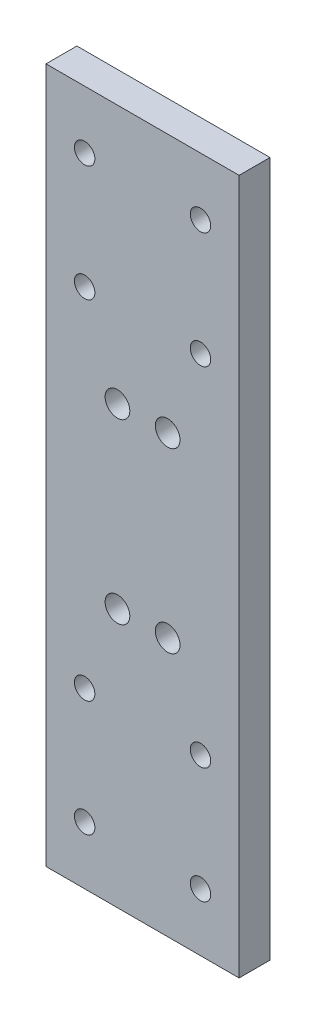
ISO-10303-21;
HEADER;
FILE_DESCRIPTION(('STEP AP214'),'2;1');
FILE_NAME('part.step','',(''),(''),'','','');
FILE_SCHEMA(('AUTOMOTIVE_DESIGN { 1 0 10303 214 1 1 1 1 }'));
ENDSEC;
DATA;
#1=APPLICATION_CONTEXT('core data for automotive mechanical design processes');
#2=APPLICATION_PROTOCOL_DEFINITION('international standard','automotive_design',2000,#1);
#3=PRODUCT_CONTEXT('',#1,'mechanical');
#4=PRODUCT('Part','Part','',(#3));
#5=PRODUCT_RELATED_PRODUCT_CATEGORY('part','',(#4));
#6=PRODUCT_DEFINITION_FORMATION('','',#4);
#7=PRODUCT_DEFINITION_CONTEXT('part definition',#1,'design');
#8=PRODUCT_DEFINITION('design','',#6,#7);
#9=PRODUCT_DEFINITION_SHAPE('','',#8);
#10=(LENGTH_UNIT() NAMED_UNIT(*) SI_UNIT(.MILLI.,.METRE.));
#11=(NAMED_UNIT(*) PLANE_ANGLE_UNIT() SI_UNIT($,.RADIAN.));
#12=(NAMED_UNIT(*) SI_UNIT($,.STERADIAN.) SOLID_ANGLE_UNIT());
#13=UNCERTAINTY_MEASURE_WITH_UNIT(LENGTH_MEASURE(1.E-05),#10,'distance_accuracy_value','');
#14=(GEOMETRIC_REPRESENTATION_CONTEXT(3) GLOBAL_UNCERTAINTY_ASSIGNED_CONTEXT((#13)) GLOBAL_UNIT_ASSIGNED_CONTEXT((#10,
#11,#12)) REPRESENTATION_CONTEXT('',''));
#15=CARTESIAN_POINT('',(0.,0.,0.));
#16=DIRECTION('',(0.,0.,1.));
#17=DIRECTION('',(1.,0.,0.));
#18=AXIS2_PLACEMENT_3D('',#15,#16,#17);
#19=CARTESIAN_POINT('',(-25.,90.,8.));
#20=DIRECTION('',(1.,0.,0.));
#21=DIRECTION('',(0.,1.,0.));
#22=AXIS2_PLACEMENT_3D('',#19,#20,#21);
#23=PLANE('',#22);
#24=DIRECTION('',(0.,-1.,0.));
#25=VECTOR('',#24,1.);
#26=CARTESIAN_POINT('',(-25.,90.,0.));
#27=LINE('',#26,#25);
#28=CARTESIAN_POINT('',(-25.,90.,0.));
#29=VERTEX_POINT('',#28);
#30=CARTESIAN_POINT('',(-25.,-90.,0.));
#31=VERTEX_POINT('',#30);
#32=EDGE_CURVE('E96',#29,#31,#27,.T.);
#33=ORIENTED_EDGE('',*,*,#32,.T.);
#34=DIRECTION('',(0.,0.,-1.));
#35=VECTOR('',#34,1.);
#36=CARTESIAN_POINT('',(-25.,-90.,8.));
#37=LINE('',#36,#35);
#38=CARTESIAN_POINT('',(-25.,-90.,8.));
#39=VERTEX_POINT('',#38);
#40=EDGE_CURVE('E11',#39,#31,#37,.T.);
#41=ORIENTED_EDGE('',*,*,#40,.F.);
#42=DIRECTION('',(0.,-1.,0.));
#43=VECTOR('',#42,1.);
#44=CARTESIAN_POINT('',(-25.,90.,8.));
#45=LINE('',#44,#43);
#46=CARTESIAN_POINT('',(-25.,90.,8.));
#47=VERTEX_POINT('',#46);
#48=EDGE_CURVE('E84',#47,#39,#45,.T.);
#49=ORIENTED_EDGE('',*,*,#48,.F.);
#50=DIRECTION('',(0.,0.,-1.));
#51=VECTOR('',#50,1.);
#52=CARTESIAN_POINT('',(-25.,90.,8.));
#53=LINE('',#52,#51);
#54=EDGE_CURVE('E92',#47,#29,#53,.T.);
#55=ORIENTED_EDGE('',*,*,#54,.T.);
#56=EDGE_LOOP('',(#33,#41,#49,#55));
#57=FACE_BOUND('',#56,.T.);
#58=ADVANCED_FACE('F33',(#57),#23,.F.);
#59=CARTESIAN_POINT('',(-25.,-90.,8.));
#60=DIRECTION('',(0.,1.,0.));
#61=DIRECTION('',(0.,0.,1.));
#62=AXIS2_PLACEMENT_3D('',#59,#60,#61);
#63=PLANE('',#62);
#64=DIRECTION('',(1.,0.,0.));
#65=VECTOR('',#64,1.);
#66=CARTESIAN_POINT('',(-25.,-90.,0.));
#67=LINE('',#66,#65);
#68=CARTESIAN_POINT('',(25.,-90.,0.));
#69=VERTEX_POINT('',#68);
#70=EDGE_CURVE('E88',#31,#69,#67,.T.);
#71=ORIENTED_EDGE('',*,*,#70,.T.);
#72=DIRECTION('',(0.,0.,-1.));
#73=VECTOR('',#72,1.);
#74=CARTESIAN_POINT('',(25.,-90.,8.));
#75=LINE('',#74,#73);
#76=CARTESIAN_POINT('',(25.,-90.,8.));
#77=VERTEX_POINT('',#76);
#78=EDGE_CURVE('E41',#77,#69,#75,.T.);
#79=ORIENTED_EDGE('',*,*,#78,.F.);
#80=DIRECTION('',(1.,0.,0.));
#81=VECTOR('',#80,1.);
#82=CARTESIAN_POINT('',(-25.,-90.,8.));
#83=LINE('',#82,#81);
#84=EDGE_CURVE('E79',#39,#77,#83,.T.);
#85=ORIENTED_EDGE('',*,*,#84,.F.);
#86=ORIENTED_EDGE('',*,*,#40,.T.);
#87=EDGE_LOOP('',(#71,#79,#85,#86));
#88=FACE_BOUND('',#87,.T.);
#89=ADVANCED_FACE('F87',(#88),#63,.F.);
#90=CARTESIAN_POINT('',(25.,90.,8.));
#91=DIRECTION('',(-1.,0.,0.));
#92=DIRECTION('',(0.,-1.,0.));
#93=AXIS2_PLACEMENT_3D('',#90,#91,#92);
#94=PLANE('',#93);
#95=DIRECTION('',(0.,1.,0.));
#96=VECTOR('',#95,1.);
#97=CARTESIAN_POINT('',(25.,90.,0.));
#98=LINE('',#97,#96);
#99=CARTESIAN_POINT('',(25.,90.,0.));
#100=VERTEX_POINT('',#99);
#101=EDGE_CURVE('E66',#69,#100,#98,.T.);
#102=ORIENTED_EDGE('',*,*,#101,.T.);
#103=DIRECTION('',(0.,0.,-1.));
#104=VECTOR('',#103,1.);
#105=CARTESIAN_POINT('',(25.,90.,8.));
#106=LINE('',#105,#104);
#107=CARTESIAN_POINT('',(25.,90.,8.));
#108=VERTEX_POINT('',#107);
#109=EDGE_CURVE('E89',#108,#100,#106,.T.);
#110=ORIENTED_EDGE('',*,*,#109,.F.);
#111=DIRECTION('',(0.,1.,0.));
#112=VECTOR('',#111,1.);
#113=CARTESIAN_POINT('',(25.,90.,8.));
#114=LINE('',#113,#112);
#115=EDGE_CURVE('E82',#77,#108,#114,.T.);
#116=ORIENTED_EDGE('',*,*,#115,.F.);
#117=ORIENTED_EDGE('',*,*,#78,.T.);
#118=EDGE_LOOP('',(#102,#110,#116,#117));
#119=FACE_BOUND('',#118,.T.);
#120=ADVANCED_FACE('F90',(#119),#94,.F.);
#121=CARTESIAN_POINT('',(-25.,90.,8.));
#122=DIRECTION('',(0.,-1.,0.));
#123=DIRECTION('',(1.,0.,0.));
#124=AXIS2_PLACEMENT_3D('',#121,#122,#123);
#125=PLANE('',#124);
#126=DIRECTION('',(-1.,0.,0.));
#127=VECTOR('',#126,1.);
#128=CARTESIAN_POINT('',(-25.,90.,0.));
#129=LINE('',#128,#127);
#130=EDGE_CURVE('E72',#100,#29,#129,.T.);
#131=ORIENTED_EDGE('',*,*,#130,.T.);
#132=ORIENTED_EDGE('',*,*,#54,.F.);
#133=DIRECTION('',(-1.,0.,0.));
#134=VECTOR('',#133,1.);
#135=CARTESIAN_POINT('',(-25.,90.,8.));
#136=LINE('',#135,#134);
#137=EDGE_CURVE('E49',#108,#47,#136,.T.);
#138=ORIENTED_EDGE('',*,*,#137,.F.);
#139=ORIENTED_EDGE('',*,*,#109,.T.);
#140=EDGE_LOOP('',(#131,#132,#138,#139));
#141=FACE_BOUND('',#140,.T.);
#142=ADVANCED_FACE('F104',(#141),#125,.F.);
#143=CARTESIAN_POINT('',(0.,0.,8.));
#144=DIRECTION('',(0.,0.,1.));
#145=DIRECTION('',(1.,0.,0.));
#146=AXIS2_PLACEMENT_3D('',#143,#144,#145);
#147=PLANE('',#146);
#148=CARTESIAN_POINT('',(-6.5,23.,8.));
#149=DIRECTION('',(0.,0.,1.));
#150=DIRECTION('',(1.,0.,0.));
#151=AXIS2_PLACEMENT_3D('',#148,#149,#150);
#152=CIRCLE('',#151,3.2);
#153=CARTESIAN_POINT('',(-3.3,23.,8.));
#154=VERTEX_POINT('',#153);
#155=EDGE_CURVE('E178',#154,#154,#152,.T.);
#156=ORIENTED_EDGE('',*,*,#155,.F.);
#157=EDGE_LOOP('',(#156));
#158=FACE_BOUND('',#157,.T.);
#159=CARTESIAN_POINT('',(-6.5,-23.,8.));
#160=DIRECTION('',(0.,0.,1.));
#161=DIRECTION('',(1.,0.,0.));
#162=AXIS2_PLACEMENT_3D('',#159,#160,#161);
#163=CIRCLE('',#162,3.2);
#164=CARTESIAN_POINT('',(-3.3,-23.,8.));
#165=VERTEX_POINT('',#164);
#166=EDGE_CURVE('E172',#165,#165,#163,.T.);
#167=ORIENTED_EDGE('',*,*,#166,.F.);
#168=EDGE_LOOP('',(#167));
#169=FACE_BOUND('',#168,.T.);
#170=CARTESIAN_POINT('',(6.5,-23.,8.));
#171=DIRECTION('',(0.,0.,1.));
#172=DIRECTION('',(1.,0.,0.));
#173=AXIS2_PLACEMENT_3D('',#170,#171,#172);
#174=CIRCLE('',#173,3.2);
#175=CARTESIAN_POINT('',(9.7,-23.,8.));
#176=VERTEX_POINT('',#175);
#177=EDGE_CURVE('E166',#176,#176,#174,.T.);
#178=ORIENTED_EDGE('',*,*,#177,.F.);
#179=EDGE_LOOP('',(#178));
#180=FACE_BOUND('',#179,.T.);
#181=CARTESIAN_POINT('',(6.5,23.,8.));
#182=DIRECTION('',(0.,0.,1.));
#183=DIRECTION('',(1.,0.,0.));
#184=AXIS2_PLACEMENT_3D('',#181,#182,#183);
#185=CIRCLE('',#184,3.2);
#186=CARTESIAN_POINT('',(9.7,23.,8.));
#187=VERTEX_POINT('',#186);
#188=EDGE_CURVE('E160',#187,#187,#185,.T.);
#189=ORIENTED_EDGE('',*,*,#188,.F.);
#190=EDGE_LOOP('',(#189));
#191=FACE_BOUND('',#190,.T.);
#192=CARTESIAN_POINT('',(-15.,45.,8.));
#193=DIRECTION('',(0.,0.,1.));
#194=DIRECTION('',(1.,0.,0.));
#195=AXIS2_PLACEMENT_3D('',#192,#193,#194);
#196=CIRCLE('',#195,2.65);
#197=CARTESIAN_POINT('',(-12.35,45.,8.));
#198=VERTEX_POINT('',#197);
#199=EDGE_CURVE('E154',#198,#198,#196,.T.);
#200=ORIENTED_EDGE('',*,*,#199,.F.);
#201=EDGE_LOOP('',(#200));
#202=FACE_BOUND('',#201,.T.);
#203=CARTESIAN_POINT('',(-15.,-45.,8.));
#204=DIRECTION('',(0.,0.,1.));
#205=DIRECTION('',(1.,0.,0.));
#206=AXIS2_PLACEMENT_3D('',#203,#204,#205);
#207=CIRCLE('',#206,2.65);
#208=CARTESIAN_POINT('',(-12.35,-45.,8.));
#209=VERTEX_POINT('',#208);
#210=EDGE_CURVE('E148',#209,#209,#207,.T.);
#211=ORIENTED_EDGE('',*,*,#210,.F.);
#212=EDGE_LOOP('',(#211));
#213=FACE_BOUND('',#212,.T.);
#214=CARTESIAN_POINT('',(15.,-45.,8.));
#215=DIRECTION('',(0.,0.,1.));
#216=DIRECTION('',(1.,0.,0.));
#217=AXIS2_PLACEMENT_3D('',#214,#215,#216);
#218=CIRCLE('',#217,2.65);
#219=CARTESIAN_POINT('',(17.65,-45.,8.));
#220=VERTEX_POINT('',#219);
#221=EDGE_CURVE('E142',#220,#220,#218,.T.);
#222=ORIENTED_EDGE('',*,*,#221,.F.);
#223=EDGE_LOOP('',(#222));
#224=FACE_BOUND('',#223,.T.);
#225=CARTESIAN_POINT('',(15.,45.,8.));
#226=DIRECTION('',(0.,0.,1.));
#227=DIRECTION('',(1.,0.,0.));
#228=AXIS2_PLACEMENT_3D('',#225,#226,#227);
#229=CIRCLE('',#228,2.65);
#230=CARTESIAN_POINT('',(17.65,45.,8.));
#231=VERTEX_POINT('',#230);
#232=EDGE_CURVE('E136',#231,#231,#229,.T.);
#233=ORIENTED_EDGE('',*,*,#232,.F.);
#234=EDGE_LOOP('',(#233));
#235=FACE_BOUND('',#234,.T.);
#236=CARTESIAN_POINT('',(-15.,75.,8.));
#237=DIRECTION('',(0.,0.,1.));
#238=DIRECTION('',(1.,0.,0.));
#239=AXIS2_PLACEMENT_3D('',#236,#237,#238);
#240=CIRCLE('',#239,2.65);
#241=CARTESIAN_POINT('',(-12.35,75.,8.));
#242=VERTEX_POINT('',#241);
#243=EDGE_CURVE('E130',#242,#242,#240,.T.);
#244=ORIENTED_EDGE('',*,*,#243,.F.);
#245=EDGE_LOOP('',(#244));
#246=FACE_BOUND('',#245,.T.);
#247=CARTESIAN_POINT('',(-15.,-75.,8.));
#248=DIRECTION('',(0.,0.,1.));
#249=DIRECTION('',(1.,0.,0.));
#250=AXIS2_PLACEMENT_3D('',#247,#248,#249);
#251=CIRCLE('',#250,2.65);
#252=CARTESIAN_POINT('',(-12.35,-75.,8.));
#253=VERTEX_POINT('',#252);
#254=EDGE_CURVE('E124',#253,#253,#251,.T.);
#255=ORIENTED_EDGE('',*,*,#254,.F.);
#256=EDGE_LOOP('',(#255));
#257=FACE_BOUND('',#256,.T.);
#258=CARTESIAN_POINT('',(15.,-75.,8.));
#259=DIRECTION('',(0.,0.,1.));
#260=DIRECTION('',(1.,0.,0.));
#261=AXIS2_PLACEMENT_3D('',#258,#259,#260);
#262=CIRCLE('',#261,2.65);
#263=CARTESIAN_POINT('',(17.65,-75.,8.));
#264=VERTEX_POINT('',#263);
#265=EDGE_CURVE('E118',#264,#264,#262,.T.);
#266=ORIENTED_EDGE('',*,*,#265,.F.);
#267=EDGE_LOOP('',(#266));
#268=FACE_BOUND('',#267,.T.);
#269=CARTESIAN_POINT('',(15.,75.,8.));
#270=DIRECTION('',(0.,0.,1.));
#271=DIRECTION('',(1.,0.,0.));
#272=AXIS2_PLACEMENT_3D('',#269,#270,#271);
#273=CIRCLE('',#272,2.65);
#274=CARTESIAN_POINT('',(17.65,75.,8.));
#275=VERTEX_POINT('',#274);
#276=EDGE_CURVE('E112',#275,#275,#273,.T.);
#277=ORIENTED_EDGE('',*,*,#276,.F.);
#278=EDGE_LOOP('',(#277));
#279=FACE_BOUND('',#278,.T.);
#280=ORIENTED_EDGE('',*,*,#48,.T.);
#281=ORIENTED_EDGE('',*,*,#84,.T.);
#282=ORIENTED_EDGE('',*,*,#115,.T.);
#283=ORIENTED_EDGE('',*,*,#137,.T.);
#284=EDGE_LOOP('',(#280,#281,#282,#283));
#285=FACE_BOUND('',#284,.T.);
#286=ADVANCED_FACE('F80',(#158,#169,#180,#191,#202,#213,#224,#235,#246,#257,#268,#279,#285),
#147,.T.);
#287=CARTESIAN_POINT('',(0.,0.,0.));
#288=DIRECTION('',(0.,0.,1.));
#289=DIRECTION('',(1.,0.,0.));
#290=AXIS2_PLACEMENT_3D('',#287,#288,#289);
#291=PLANE('',#290);
#292=CARTESIAN_POINT('',(-6.5,23.,0.));
#293=DIRECTION('',(0.,0.,1.));
#294=DIRECTION('',(1.,0.,0.));
#295=AXIS2_PLACEMENT_3D('',#292,#293,#294);
#296=CIRCLE('',#295,3.2);
#297=CARTESIAN_POINT('',(-3.3,23.,0.));
#298=VERTEX_POINT('',#297);
#299=EDGE_CURVE('E175',#298,#298,#296,.T.);
#300=ORIENTED_EDGE('',*,*,#299,.T.);
#301=EDGE_LOOP('',(#300));
#302=FACE_BOUND('',#301,.T.);
#303=CARTESIAN_POINT('',(-6.5,-23.,0.));
#304=DIRECTION('',(0.,0.,1.));
#305=DIRECTION('',(1.,0.,0.));
#306=AXIS2_PLACEMENT_3D('',#303,#304,#305);
#307=CIRCLE('',#306,3.2);
#308=CARTESIAN_POINT('',(-3.3,-23.,0.));
#309=VERTEX_POINT('',#308);
#310=EDGE_CURVE('E169',#309,#309,#307,.T.);
#311=ORIENTED_EDGE('',*,*,#310,.T.);
#312=EDGE_LOOP('',(#311));
#313=FACE_BOUND('',#312,.T.);
#314=CARTESIAN_POINT('',(6.5,-23.,0.));
#315=DIRECTION('',(0.,0.,1.));
#316=DIRECTION('',(1.,0.,0.));
#317=AXIS2_PLACEMENT_3D('',#314,#315,#316);
#318=CIRCLE('',#317,3.2);
#319=CARTESIAN_POINT('',(9.7,-23.,0.));
#320=VERTEX_POINT('',#319);
#321=EDGE_CURVE('E163',#320,#320,#318,.T.);
#322=ORIENTED_EDGE('',*,*,#321,.T.);
#323=EDGE_LOOP('',(#322));
#324=FACE_BOUND('',#323,.T.);
#325=CARTESIAN_POINT('',(6.5,23.,0.));
#326=DIRECTION('',(0.,0.,1.));
#327=DIRECTION('',(1.,0.,0.));
#328=AXIS2_PLACEMENT_3D('',#325,#326,#327);
#329=CIRCLE('',#328,3.2);
#330=CARTESIAN_POINT('',(9.7,23.,0.));
#331=VERTEX_POINT('',#330);
#332=EDGE_CURVE('E157',#331,#331,#329,.T.);
#333=ORIENTED_EDGE('',*,*,#332,.T.);
#334=EDGE_LOOP('',(#333));
#335=FACE_BOUND('',#334,.T.);
#336=CARTESIAN_POINT('',(-15.,45.,0.));
#337=DIRECTION('',(0.,0.,1.));
#338=DIRECTION('',(1.,0.,0.));
#339=AXIS2_PLACEMENT_3D('',#336,#337,#338);
#340=CIRCLE('',#339,2.65);
#341=CARTESIAN_POINT('',(-12.35,45.,0.));
#342=VERTEX_POINT('',#341);
#343=EDGE_CURVE('E151',#342,#342,#340,.T.);
#344=ORIENTED_EDGE('',*,*,#343,.T.);
#345=EDGE_LOOP('',(#344));
#346=FACE_BOUND('',#345,.T.);
#347=CARTESIAN_POINT('',(-15.,-45.,0.));
#348=DIRECTION('',(0.,0.,1.));
#349=DIRECTION('',(1.,0.,0.));
#350=AXIS2_PLACEMENT_3D('',#347,#348,#349);
#351=CIRCLE('',#350,2.65);
#352=CARTESIAN_POINT('',(-12.35,-45.,0.));
#353=VERTEX_POINT('',#352);
#354=EDGE_CURVE('E145',#353,#353,#351,.T.);
#355=ORIENTED_EDGE('',*,*,#354,.T.);
#356=EDGE_LOOP('',(#355));
#357=FACE_BOUND('',#356,.T.);
#358=CARTESIAN_POINT('',(15.,-45.,0.));
#359=DIRECTION('',(0.,0.,1.));
#360=DIRECTION('',(1.,0.,0.));
#361=AXIS2_PLACEMENT_3D('',#358,#359,#360);
#362=CIRCLE('',#361,2.65);
#363=CARTESIAN_POINT('',(17.65,-45.,0.));
#364=VERTEX_POINT('',#363);
#365=EDGE_CURVE('E139',#364,#364,#362,.T.);
#366=ORIENTED_EDGE('',*,*,#365,.T.);
#367=EDGE_LOOP('',(#366));
#368=FACE_BOUND('',#367,.T.);
#369=CARTESIAN_POINT('',(15.,45.,0.));
#370=DIRECTION('',(0.,0.,1.));
#371=DIRECTION('',(1.,0.,0.));
#372=AXIS2_PLACEMENT_3D('',#369,#370,#371);
#373=CIRCLE('',#372,2.65);
#374=CARTESIAN_POINT('',(17.65,45.,0.));
#375=VERTEX_POINT('',#374);
#376=EDGE_CURVE('E133',#375,#375,#373,.T.);
#377=ORIENTED_EDGE('',*,*,#376,.T.);
#378=EDGE_LOOP('',(#377));
#379=FACE_BOUND('',#378,.T.);
#380=CARTESIAN_POINT('',(-15.,75.,0.));
#381=DIRECTION('',(0.,0.,1.));
#382=DIRECTION('',(1.,0.,0.));
#383=AXIS2_PLACEMENT_3D('',#380,#381,#382);
#384=CIRCLE('',#383,2.65);
#385=CARTESIAN_POINT('',(-12.35,75.,0.));
#386=VERTEX_POINT('',#385);
#387=EDGE_CURVE('E127',#386,#386,#384,.T.);
#388=ORIENTED_EDGE('',*,*,#387,.T.);
#389=EDGE_LOOP('',(#388));
#390=FACE_BOUND('',#389,.T.);
#391=CARTESIAN_POINT('',(-15.,-75.,0.));
#392=DIRECTION('',(0.,0.,1.));
#393=DIRECTION('',(1.,0.,0.));
#394=AXIS2_PLACEMENT_3D('',#391,#392,#393);
#395=CIRCLE('',#394,2.65);
#396=CARTESIAN_POINT('',(-12.35,-75.,0.));
#397=VERTEX_POINT('',#396);
#398=EDGE_CURVE('E121',#397,#397,#395,.T.);
#399=ORIENTED_EDGE('',*,*,#398,.T.);
#400=EDGE_LOOP('',(#399));
#401=FACE_BOUND('',#400,.T.);
#402=CARTESIAN_POINT('',(15.,-75.,0.));
#403=DIRECTION('',(0.,0.,1.));
#404=DIRECTION('',(1.,0.,0.));
#405=AXIS2_PLACEMENT_3D('',#402,#403,#404);
#406=CIRCLE('',#405,2.65);
#407=CARTESIAN_POINT('',(17.65,-75.,0.));
#408=VERTEX_POINT('',#407);
#409=EDGE_CURVE('E115',#408,#408,#406,.T.);
#410=ORIENTED_EDGE('',*,*,#409,.T.);
#411=EDGE_LOOP('',(#410));
#412=FACE_BOUND('',#411,.T.);
#413=CARTESIAN_POINT('',(15.,75.,0.));
#414=DIRECTION('',(0.,0.,1.));
#415=DIRECTION('',(1.,0.,0.));
#416=AXIS2_PLACEMENT_3D('',#413,#414,#415);
#417=CIRCLE('',#416,2.65);
#418=CARTESIAN_POINT('',(17.65,75.,0.));
#419=VERTEX_POINT('',#418);
#420=EDGE_CURVE('E99',#419,#419,#417,.T.);
#421=ORIENTED_EDGE('',*,*,#420,.T.);
#422=EDGE_LOOP('',(#421));
#423=FACE_BOUND('',#422,.T.);
#424=ORIENTED_EDGE('',*,*,#32,.F.);
#425=ORIENTED_EDGE('',*,*,#130,.F.);
#426=ORIENTED_EDGE('',*,*,#101,.F.);
#427=ORIENTED_EDGE('',*,*,#70,.F.);
#428=EDGE_LOOP('',(#424,#425,#426,#427));
#429=FACE_BOUND('',#428,.T.);
#430=ADVANCED_FACE('F107',(#302,#313,#324,#335,#346,#357,#368,#379,#390,#401,#412,#423,#429),
#291,.F.);
#431=CARTESIAN_POINT('',(15.,75.,8.));
#432=DIRECTION('',(0.,0.,1.));
#433=DIRECTION('',(1.,0.,0.));
#434=AXIS2_PLACEMENT_3D('',#431,#432,#433);
#435=CYLINDRICAL_SURFACE('',#434,2.65);
#436=ORIENTED_EDGE('',*,*,#420,.F.);
#437=EDGE_LOOP('',(#436));
#438=FACE_BOUND('',#437,.T.);
#439=ORIENTED_EDGE('',*,*,#276,.T.);
#440=EDGE_LOOP('',(#439));
#441=FACE_BOUND('',#440,.T.);
#442=ADVANCED_FACE('F209',(#438,#441),#435,.F.);
#443=CARTESIAN_POINT('',(15.,-75.,8.));
#444=DIRECTION('',(0.,0.,1.));
#445=DIRECTION('',(1.,0.,0.));
#446=AXIS2_PLACEMENT_3D('',#443,#444,#445);
#447=CYLINDRICAL_SURFACE('',#446,2.65);
#448=ORIENTED_EDGE('',*,*,#409,.F.);
#449=EDGE_LOOP('',(#448));
#450=FACE_BOUND('',#449,.T.);
#451=ORIENTED_EDGE('',*,*,#265,.T.);
#452=EDGE_LOOP('',(#451));
#453=FACE_BOUND('',#452,.T.);
#454=ADVANCED_FACE('F211',(#450,#453),#447,.F.);
#455=CARTESIAN_POINT('',(-15.,-75.,8.));
#456=DIRECTION('',(0.,0.,1.));
#457=DIRECTION('',(1.,0.,0.));
#458=AXIS2_PLACEMENT_3D('',#455,#456,#457);
#459=CYLINDRICAL_SURFACE('',#458,2.65);
#460=ORIENTED_EDGE('',*,*,#398,.F.);
#461=EDGE_LOOP('',(#460));
#462=FACE_BOUND('',#461,.T.);
#463=ORIENTED_EDGE('',*,*,#254,.T.);
#464=EDGE_LOOP('',(#463));
#465=FACE_BOUND('',#464,.T.);
#466=ADVANCED_FACE('F218',(#462,#465),#459,.F.);
#467=CARTESIAN_POINT('',(-15.,75.,8.));
#468=DIRECTION('',(0.,0.,1.));
#469=DIRECTION('',(1.,0.,0.));
#470=AXIS2_PLACEMENT_3D('',#467,#468,#469);
#471=CYLINDRICAL_SURFACE('',#470,2.65);
#472=ORIENTED_EDGE('',*,*,#387,.F.);
#473=EDGE_LOOP('',(#472));
#474=FACE_BOUND('',#473,.T.);
#475=ORIENTED_EDGE('',*,*,#243,.T.);
#476=EDGE_LOOP('',(#475));
#477=FACE_BOUND('',#476,.T.);
#478=ADVANCED_FACE('F309',(#474,#477),#471,.F.);
#479=CARTESIAN_POINT('',(15.,45.,8.));
#480=DIRECTION('',(0.,0.,1.));
#481=DIRECTION('',(1.,0.,0.));
#482=AXIS2_PLACEMENT_3D('',#479,#480,#481);
#483=CYLINDRICAL_SURFACE('',#482,2.65);
#484=ORIENTED_EDGE('',*,*,#376,.F.);
#485=EDGE_LOOP('',(#484));
#486=FACE_BOUND('',#485,.T.);
#487=ORIENTED_EDGE('',*,*,#232,.T.);
#488=EDGE_LOOP('',(#487));
#489=FACE_BOUND('',#488,.T.);
#490=ADVANCED_FACE('F305',(#486,#489),#483,.F.);
#491=CARTESIAN_POINT('',(15.,-45.,8.));
#492=DIRECTION('',(0.,0.,1.));
#493=DIRECTION('',(1.,0.,0.));
#494=AXIS2_PLACEMENT_3D('',#491,#492,#493);
#495=CYLINDRICAL_SURFACE('',#494,2.65);
#496=ORIENTED_EDGE('',*,*,#365,.F.);
#497=EDGE_LOOP('',(#496));
#498=FACE_BOUND('',#497,.T.);
#499=ORIENTED_EDGE('',*,*,#221,.T.);
#500=EDGE_LOOP('',(#499));
#501=FACE_BOUND('',#500,.T.);
#502=ADVANCED_FACE('F301',(#498,#501),#495,.F.);
#503=CARTESIAN_POINT('',(-15.,-45.,8.));
#504=DIRECTION('',(0.,0.,1.));
#505=DIRECTION('',(1.,0.,0.));
#506=AXIS2_PLACEMENT_3D('',#503,#504,#505);
#507=CYLINDRICAL_SURFACE('',#506,2.65);
#508=ORIENTED_EDGE('',*,*,#354,.F.);
#509=EDGE_LOOP('',(#508));
#510=FACE_BOUND('',#509,.T.);
#511=ORIENTED_EDGE('',*,*,#210,.T.);
#512=EDGE_LOOP('',(#511));
#513=FACE_BOUND('',#512,.T.);
#514=ADVANCED_FACE('F297',(#510,#513),#507,.F.);
#515=CARTESIAN_POINT('',(-15.,45.,8.));
#516=DIRECTION('',(0.,0.,1.));
#517=DIRECTION('',(1.,0.,0.));
#518=AXIS2_PLACEMENT_3D('',#515,#516,#517);
#519=CYLINDRICAL_SURFACE('',#518,2.65);
#520=ORIENTED_EDGE('',*,*,#343,.F.);
#521=EDGE_LOOP('',(#520));
#522=FACE_BOUND('',#521,.T.);
#523=ORIENTED_EDGE('',*,*,#199,.T.);
#524=EDGE_LOOP('',(#523));
#525=FACE_BOUND('',#524,.T.);
#526=ADVANCED_FACE('F259',(#522,#525),#519,.F.);
#527=CARTESIAN_POINT('',(6.5,23.,8.));
#528=DIRECTION('',(0.,0.,1.));
#529=DIRECTION('',(1.,0.,0.));
#530=AXIS2_PLACEMENT_3D('',#527,#528,#529);
#531=CYLINDRICAL_SURFACE('',#530,3.2);
#532=ORIENTED_EDGE('',*,*,#332,.F.);
#533=EDGE_LOOP('',(#532));
#534=FACE_BOUND('',#533,.T.);
#535=ORIENTED_EDGE('',*,*,#188,.T.);
#536=EDGE_LOOP('',(#535));
#537=FACE_BOUND('',#536,.T.);
#538=ADVANCED_FACE('F253',(#534,#537),#531,.F.);
#539=CARTESIAN_POINT('',(6.5,-23.,8.));
#540=DIRECTION('',(0.,0.,1.));
#541=DIRECTION('',(1.,0.,0.));
#542=AXIS2_PLACEMENT_3D('',#539,#540,#541);
#543=CYLINDRICAL_SURFACE('',#542,3.2);
#544=ORIENTED_EDGE('',*,*,#321,.F.);
#545=EDGE_LOOP('',(#544));
#546=FACE_BOUND('',#545,.T.);
#547=ORIENTED_EDGE('',*,*,#177,.T.);
#548=EDGE_LOOP('',(#547));
#549=FACE_BOUND('',#548,.T.);
#550=ADVANCED_FACE('F258',(#546,#549),#543,.F.);
#551=CARTESIAN_POINT('',(-6.5,-23.,8.));
#552=DIRECTION('',(0.,0.,1.));
#553=DIRECTION('',(1.,0.,0.));
#554=AXIS2_PLACEMENT_3D('',#551,#552,#553);
#555=CYLINDRICAL_SURFACE('',#554,3.2);
#556=ORIENTED_EDGE('',*,*,#310,.F.);
#557=EDGE_LOOP('',(#556));
#558=FACE_BOUND('',#557,.T.);
#559=ORIENTED_EDGE('',*,*,#166,.T.);
#560=EDGE_LOOP('',(#559));
#561=FACE_BOUND('',#560,.T.);
#562=ADVANCED_FACE('F271',(#558,#561),#555,.F.);
#563=CARTESIAN_POINT('',(-6.5,23.,8.));
#564=DIRECTION('',(0.,0.,1.));
#565=DIRECTION('',(1.,0.,0.));
#566=AXIS2_PLACEMENT_3D('',#563,#564,#565);
#567=CYLINDRICAL_SURFACE('',#566,3.2);
#568=ORIENTED_EDGE('',*,*,#299,.F.);
#569=EDGE_LOOP('',(#568));
#570=FACE_BOUND('',#569,.T.);
#571=ORIENTED_EDGE('',*,*,#155,.T.);
#572=EDGE_LOOP('',(#571));
#573=FACE_BOUND('',#572,.T.);
#574=ADVANCED_FACE('F182',(#570,#573),#567,.F.);
#575=CLOSED_SHELL('',(#58,#89,#120,#142,#286,#430,#442,#454,#466,#478,#490,#502,#514,#526,#538,
#550,#562,#574));
#576=MANIFOLD_SOLID_BREP('B2',#575);
#577=ADVANCED_BREP_SHAPE_REPRESENTATION('',(#18,#576),#14);
#578=SHAPE_DEFINITION_REPRESENTATION(#9,#577);
ENDSEC;
END-ISO-10303-21;
